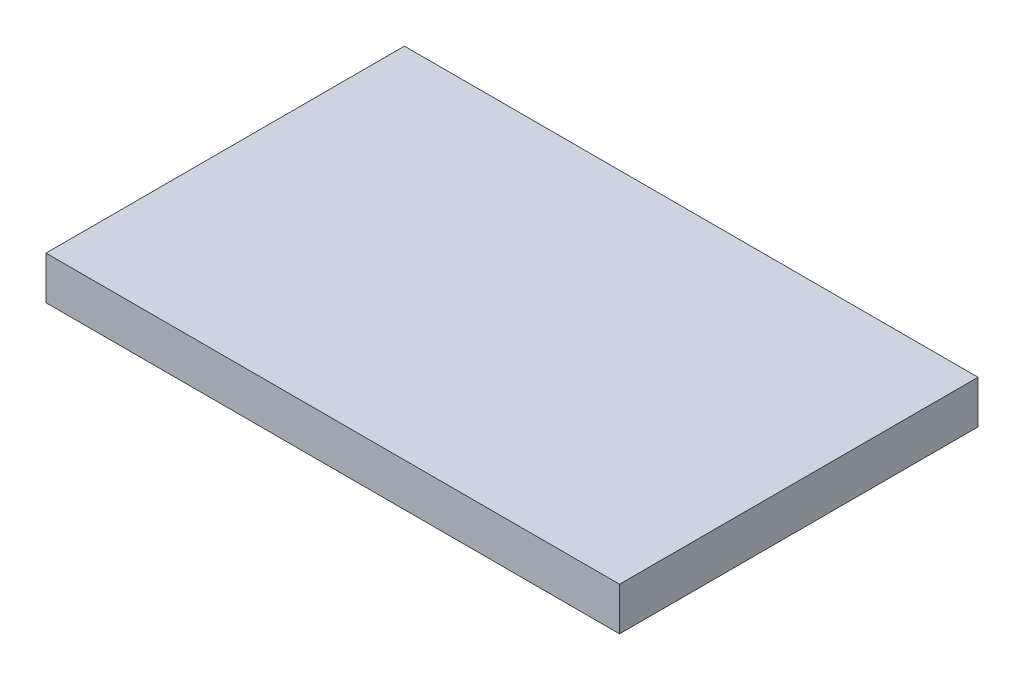
ISO-10303-21;
HEADER;
FILE_DESCRIPTION(('STEP AP214'),'2;1');
FILE_NAME('part.step','',(''),(''),'','','');
FILE_SCHEMA(('AUTOMOTIVE_DESIGN { 1 0 10303 214 1 1 1 1 }'));
ENDSEC;
DATA;
#1=APPLICATION_CONTEXT('core data for automotive mechanical design processes');
#2=APPLICATION_PROTOCOL_DEFINITION('international standard','automotive_design',2000,#1);
#3=PRODUCT_CONTEXT('',#1,'mechanical');
#4=PRODUCT('Part','Part','',(#3));
#5=PRODUCT_RELATED_PRODUCT_CATEGORY('part','',(#4));
#6=PRODUCT_DEFINITION_FORMATION('','',#4);
#7=PRODUCT_DEFINITION_CONTEXT('part definition',#1,'design');
#8=PRODUCT_DEFINITION('design','',#6,#7);
#9=PRODUCT_DEFINITION_SHAPE('','',#8);
#10=(LENGTH_UNIT() NAMED_UNIT(*) SI_UNIT(.MILLI.,.METRE.));
#11=(NAMED_UNIT(*) PLANE_ANGLE_UNIT() SI_UNIT($,.RADIAN.));
#12=(NAMED_UNIT(*) SI_UNIT($,.STERADIAN.) SOLID_ANGLE_UNIT());
#13=UNCERTAINTY_MEASURE_WITH_UNIT(LENGTH_MEASURE(1.E-05),#10,'distance_accuracy_value','');
#14=(GEOMETRIC_REPRESENTATION_CONTEXT(3) GLOBAL_UNCERTAINTY_ASSIGNED_CONTEXT((#13)) GLOBAL_UNIT_ASSIGNED_CONTEXT((#10,
#11,#12)) REPRESENTATION_CONTEXT('',''));
#15=CARTESIAN_POINT('',(0.,0.,0.));
#16=DIRECTION('',(0.,0.,1.));
#17=DIRECTION('',(1.,0.,0.));
#18=AXIS2_PLACEMENT_3D('',#15,#16,#17);
#19=CARTESIAN_POINT('',(-20.,-3.,12.5));
#20=DIRECTION('',(-1.,0.,0.));
#21=DIRECTION('',(0.,0.,1.));
#22=AXIS2_PLACEMENT_3D('',#19,#20,#21);
#23=PLANE('',#22);
#24=DIRECTION('',(0.,0.,1.));
#25=VECTOR('',#24,1.);
#26=CARTESIAN_POINT('',(-20.,0.,12.5));
#27=LINE('',#26,#25);
#28=CARTESIAN_POINT('',(-20.,0.,-12.5));
#29=VERTEX_POINT('',#28);
#30=CARTESIAN_POINT('',(-20.,0.,12.5));
#31=VERTEX_POINT('',#30);
#32=EDGE_CURVE('E101',#29,#31,#27,.T.);
#33=ORIENTED_EDGE('',*,*,#32,.F.);
#34=DIRECTION('',(0.,1.,0.));
#35=VECTOR('',#34,1.);
#36=CARTESIAN_POINT('',(-20.,-3.,-12.5));
#37=LINE('',#36,#35);
#38=CARTESIAN_POINT('',(-20.,-3.,-12.5));
#39=VERTEX_POINT('',#38);
#40=EDGE_CURVE('E11',#39,#29,#37,.T.);
#41=ORIENTED_EDGE('',*,*,#40,.F.);
#42=DIRECTION('',(0.,0.,1.));
#43=VECTOR('',#42,1.);
#44=CARTESIAN_POINT('',(-20.,-3.,12.5));
#45=LINE('',#44,#43);
#46=CARTESIAN_POINT('',(-20.,-3.,12.5));
#47=VERTEX_POINT('',#46);
#48=EDGE_CURVE('E95',#39,#47,#45,.T.);
#49=ORIENTED_EDGE('',*,*,#48,.T.);
#50=DIRECTION('',(0.,1.,0.));
#51=VECTOR('',#50,1.);
#52=CARTESIAN_POINT('',(-20.,-3.,12.5));
#53=LINE('',#52,#51);
#54=EDGE_CURVE('E40',#47,#31,#53,.T.);
#55=ORIENTED_EDGE('',*,*,#54,.T.);
#56=EDGE_LOOP('',(#33,#41,#49,#55));
#57=FACE_BOUND('',#56,.T.);
#58=ADVANCED_FACE('F37',(#57),#23,.T.);
#59=CARTESIAN_POINT('',(20.,-3.,-12.5));
#60=DIRECTION('',(0.,0.,-1.));
#61=DIRECTION('',(-1.,0.,0.));
#62=AXIS2_PLACEMENT_3D('',#59,#60,#61);
#63=PLANE('',#62);
#64=DIRECTION('',(-1.,0.,0.));
#65=VECTOR('',#64,1.);
#66=CARTESIAN_POINT('',(20.,0.,-12.5));
#67=LINE('',#66,#65);
#68=CARTESIAN_POINT('',(20.,0.,-12.5));
#69=VERTEX_POINT('',#68);
#70=EDGE_CURVE('E97',#69,#29,#67,.T.);
#71=ORIENTED_EDGE('',*,*,#70,.F.);
#72=DIRECTION('',(0.,1.,0.));
#73=VECTOR('',#72,1.);
#74=CARTESIAN_POINT('',(20.,-3.,-12.5));
#75=LINE('',#74,#73);
#76=CARTESIAN_POINT('',(20.,-3.,-12.5));
#77=VERTEX_POINT('',#76);
#78=EDGE_CURVE('E46',#77,#69,#75,.T.);
#79=ORIENTED_EDGE('',*,*,#78,.F.);
#80=DIRECTION('',(-1.,0.,0.));
#81=VECTOR('',#80,1.);
#82=CARTESIAN_POINT('',(20.,-3.,-12.5));
#83=LINE('',#82,#81);
#84=EDGE_CURVE('E92',#77,#39,#83,.T.);
#85=ORIENTED_EDGE('',*,*,#84,.T.);
#86=ORIENTED_EDGE('',*,*,#40,.T.);
#87=EDGE_LOOP('',(#71,#79,#85,#86));
#88=FACE_BOUND('',#87,.T.);
#89=ADVANCED_FACE('F111',(#88),#63,.T.);
#90=CARTESIAN_POINT('',(20.,-3.,12.5));
#91=DIRECTION('',(1.,0.,0.));
#92=DIRECTION('',(0.,0.,-1.));
#93=AXIS2_PLACEMENT_3D('',#90,#91,#92);
#94=PLANE('',#93);
#95=DIRECTION('',(0.,0.,-1.));
#96=VECTOR('',#95,1.);
#97=CARTESIAN_POINT('',(20.,0.,12.5));
#98=LINE('',#97,#96);
#99=CARTESIAN_POINT('',(20.,0.,12.5));
#100=VERTEX_POINT('',#99);
#101=EDGE_CURVE('E87',#100,#69,#98,.T.);
#102=ORIENTED_EDGE('',*,*,#101,.F.);
#103=DIRECTION('',(0.,1.,0.));
#104=VECTOR('',#103,1.);
#105=CARTESIAN_POINT('',(20.,-3.,12.5));
#106=LINE('',#105,#104);
#107=CARTESIAN_POINT('',(20.,-3.,12.5));
#108=VERTEX_POINT('',#107);
#109=EDGE_CURVE('E82',#108,#100,#106,.T.);
#110=ORIENTED_EDGE('',*,*,#109,.F.);
#111=DIRECTION('',(0.,0.,-1.));
#112=VECTOR('',#111,1.);
#113=CARTESIAN_POINT('',(20.,-3.,12.5));
#114=LINE('',#113,#112);
#115=EDGE_CURVE('E85',#108,#77,#114,.T.);
#116=ORIENTED_EDGE('',*,*,#115,.T.);
#117=ORIENTED_EDGE('',*,*,#78,.T.);
#118=EDGE_LOOP('',(#102,#110,#116,#117));
#119=FACE_BOUND('',#118,.T.);
#120=ADVANCED_FACE('F84',(#119),#94,.T.);
#121=CARTESIAN_POINT('',(20.,-3.,12.5));
#122=DIRECTION('',(0.,0.,1.));
#123=DIRECTION('',(1.,0.,0.));
#124=AXIS2_PLACEMENT_3D('',#121,#122,#123);
#125=PLANE('',#124);
#126=DIRECTION('',(1.,0.,0.));
#127=VECTOR('',#126,1.);
#128=CARTESIAN_POINT('',(20.,0.,12.5));
#129=LINE('',#128,#127);
#130=EDGE_CURVE('E104',#31,#100,#129,.T.);
#131=ORIENTED_EDGE('',*,*,#130,.F.);
#132=ORIENTED_EDGE('',*,*,#54,.F.);
#133=DIRECTION('',(1.,0.,0.));
#134=VECTOR('',#133,1.);
#135=CARTESIAN_POINT('',(20.,-3.,12.5));
#136=LINE('',#135,#134);
#137=EDGE_CURVE('E91',#47,#108,#136,.T.);
#138=ORIENTED_EDGE('',*,*,#137,.T.);
#139=ORIENTED_EDGE('',*,*,#109,.T.);
#140=EDGE_LOOP('',(#131,#132,#138,#139));
#141=FACE_BOUND('',#140,.T.);
#142=ADVANCED_FACE('F94',(#141),#125,.T.);
#143=CARTESIAN_POINT('',(0.,-3.,0.));
#144=DIRECTION('',(0.,1.,0.));
#145=DIRECTION('',(0.,0.,1.));
#146=AXIS2_PLACEMENT_3D('',#143,#144,#145);
#147=PLANE('',#146);
#148=ORIENTED_EDGE('',*,*,#48,.F.);
#149=ORIENTED_EDGE('',*,*,#84,.F.);
#150=ORIENTED_EDGE('',*,*,#115,.F.);
#151=ORIENTED_EDGE('',*,*,#137,.F.);
#152=EDGE_LOOP('',(#148,#149,#150,#151));
#153=FACE_BOUND('',#152,.T.);
#154=ADVANCED_FACE('F90',(#153),#147,.F.);
#155=CARTESIAN_POINT('',(0.,0.,0.));
#156=DIRECTION('',(0.,1.,0.));
#157=DIRECTION('',(0.,0.,1.));
#158=AXIS2_PLACEMENT_3D('',#155,#156,#157);
#159=PLANE('',#158);
#160=ORIENTED_EDGE('',*,*,#32,.T.);
#161=ORIENTED_EDGE('',*,*,#130,.T.);
#162=ORIENTED_EDGE('',*,*,#101,.T.);
#163=ORIENTED_EDGE('',*,*,#70,.T.);
#164=EDGE_LOOP('',(#160,#161,#162,#163));
#165=FACE_BOUND('',#164,.T.);
#166=ADVANCED_FACE('F110',(#165),#159,.T.);
#167=CLOSED_SHELL('',(#58,#89,#120,#142,#154,#166));
#168=MANIFOLD_SOLID_BREP('B2',#167);
#169=ADVANCED_BREP_SHAPE_REPRESENTATION('',(#18,#168),#14);
#170=SHAPE_DEFINITION_REPRESENTATION(#9,#169);
ENDSEC;
END-ISO-10303-21;
